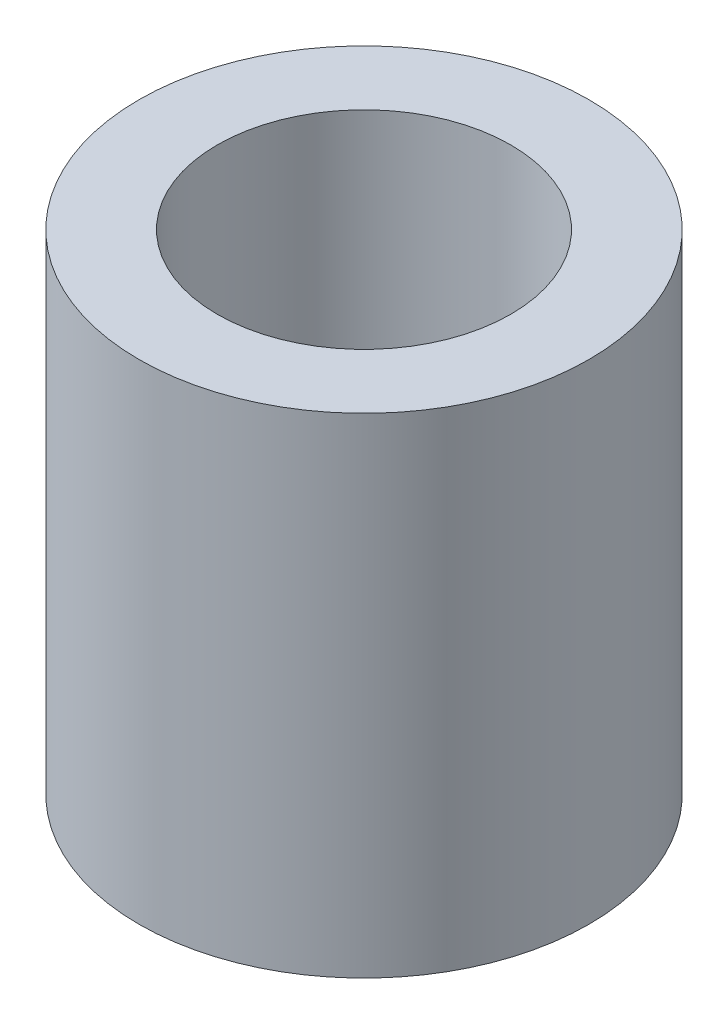
ISO-10303-21;
HEADER;
FILE_DESCRIPTION(('STEP AP214'),'2;1');
FILE_NAME('part.step','',(''),(''),'','','');
FILE_SCHEMA(('AUTOMOTIVE_DESIGN { 1 0 10303 214 1 1 1 1 }'));
ENDSEC;
DATA;
#1=APPLICATION_CONTEXT('core data for automotive mechanical design processes');
#2=APPLICATION_PROTOCOL_DEFINITION('international standard','automotive_design',2000,#1);
#3=PRODUCT_CONTEXT('',#1,'mechanical');
#4=PRODUCT('Part','Part','',(#3));
#5=PRODUCT_RELATED_PRODUCT_CATEGORY('part','',(#4));
#6=PRODUCT_DEFINITION_FORMATION('','',#4);
#7=PRODUCT_DEFINITION_CONTEXT('part definition',#1,'design');
#8=PRODUCT_DEFINITION('design','',#6,#7);
#9=PRODUCT_DEFINITION_SHAPE('','',#8);
#10=(LENGTH_UNIT() NAMED_UNIT(*) SI_UNIT(.MILLI.,.METRE.));
#11=(NAMED_UNIT(*) PLANE_ANGLE_UNIT() SI_UNIT($,.RADIAN.));
#12=(NAMED_UNIT(*) SI_UNIT($,.STERADIAN.) SOLID_ANGLE_UNIT());
#13=UNCERTAINTY_MEASURE_WITH_UNIT(LENGTH_MEASURE(1.E-05),#10,'distance_accuracy_value','');
#14=(GEOMETRIC_REPRESENTATION_CONTEXT(3) GLOBAL_UNCERTAINTY_ASSIGNED_CONTEXT((#13)) GLOBAL_UNIT_ASSIGNED_CONTEXT((#10,
#11,#12)) REPRESENTATION_CONTEXT('',''));
#15=CARTESIAN_POINT('',(0.,0.,0.));
#16=DIRECTION('',(0.,0.,1.));
#17=DIRECTION('',(1.,0.,0.));
#18=AXIS2_PLACEMENT_3D('',#15,#16,#17);
#19=CARTESIAN_POINT('',(0.,0.,0.));
#20=DIRECTION('',(0.,-1.,0.));
#21=DIRECTION('',(0.,0.,-1.));
#22=AXIS2_PLACEMENT_3D('',#19,#20,#21);
#23=CYLINDRICAL_SURFACE('',#22,1.5);
#24=CARTESIAN_POINT('',(0.,5.,0.));
#25=DIRECTION('',(0.,-1.,0.));
#26=DIRECTION('',(0.,0.,-1.));
#27=AXIS2_PLACEMENT_3D('',#24,#25,#26);
#28=CIRCLE('',#27,1.5);
#29=CARTESIAN_POINT('',(0.,5.,-1.5));
#30=VERTEX_POINT('',#29);
#31=EDGE_CURVE('E10',#30,#30,#28,.T.);
#32=ORIENTED_EDGE('',*,*,#31,.F.);
#33=EDGE_LOOP('',(#32));
#34=FACE_BOUND('',#33,.T.);
#35=CARTESIAN_POINT('',(0.,0.,0.));
#36=DIRECTION('',(0.,-1.,0.));
#37=DIRECTION('',(0.,0.,-1.));
#38=AXIS2_PLACEMENT_3D('',#35,#36,#37);
#39=CIRCLE('',#38,1.5);
#40=CARTESIAN_POINT('',(0.,0.,-1.5));
#41=VERTEX_POINT('',#40);
#42=EDGE_CURVE('E44',#41,#41,#39,.T.);
#43=ORIENTED_EDGE('',*,*,#42,.T.);
#44=EDGE_LOOP('',(#43));
#45=FACE_BOUND('',#44,.T.);
#46=ADVANCED_FACE('F30',(#34,#45),#23,.F.);
#47=CARTESIAN_POINT('',(-1.5,5.,0.));
#48=DIRECTION('',(0.,-1.,0.));
#49=DIRECTION('',(0.,0.,-1.));
#50=AXIS2_PLACEMENT_3D('',#47,#48,#49);
#51=PLANE('',#50);
#52=CARTESIAN_POINT('',(0.,5.,0.));
#53=DIRECTION('',(0.,-1.,0.));
#54=DIRECTION('',(0.,0.,-1.));
#55=AXIS2_PLACEMENT_3D('',#52,#53,#54);
#56=CIRCLE('',#55,2.3);
#57=CARTESIAN_POINT('',(0.,5.,-2.3));
#58=VERTEX_POINT('',#57);
#59=EDGE_CURVE('E36',#58,#58,#56,.T.);
#60=ORIENTED_EDGE('',*,*,#59,.F.);
#61=EDGE_LOOP('',(#60));
#62=FACE_BOUND('',#61,.T.);
#63=ORIENTED_EDGE('',*,*,#31,.T.);
#64=EDGE_LOOP('',(#63));
#65=FACE_BOUND('',#64,.T.);
#66=ADVANCED_FACE('F59',(#62,#65),#51,.F.);
#67=CARTESIAN_POINT('',(0.,0.,0.));
#68=DIRECTION('',(0.,-1.,0.));
#69=DIRECTION('',(0.,0.,-1.));
#70=AXIS2_PLACEMENT_3D('',#67,#68,#69);
#71=CYLINDRICAL_SURFACE('',#70,2.3);
#72=CARTESIAN_POINT('',(0.,0.,0.));
#73=DIRECTION('',(0.,-1.,0.));
#74=DIRECTION('',(0.,0.,-1.));
#75=AXIS2_PLACEMENT_3D('',#72,#73,#74);
#76=CIRCLE('',#75,2.3);
#77=CARTESIAN_POINT('',(0.,0.,-2.3));
#78=VERTEX_POINT('',#77);
#79=EDGE_CURVE('E40',#78,#78,#76,.T.);
#80=ORIENTED_EDGE('',*,*,#79,.F.);
#81=EDGE_LOOP('',(#80));
#82=FACE_BOUND('',#81,.T.);
#83=ORIENTED_EDGE('',*,*,#59,.T.);
#84=EDGE_LOOP('',(#83));
#85=FACE_BOUND('',#84,.T.);
#86=ADVANCED_FACE('F54',(#82,#85),#71,.T.);
#87=CARTESIAN_POINT('',(-1.5,0.,0.));
#88=DIRECTION('',(0.,1.,0.));
#89=DIRECTION('',(0.,0.,1.));
#90=AXIS2_PLACEMENT_3D('',#87,#88,#89);
#91=PLANE('',#90);
#92=ORIENTED_EDGE('',*,*,#42,.F.);
#93=EDGE_LOOP('',(#92));
#94=FACE_BOUND('',#93,.T.);
#95=ORIENTED_EDGE('',*,*,#79,.T.);
#96=EDGE_LOOP('',(#95));
#97=FACE_BOUND('',#96,.T.);
#98=ADVANCED_FACE('F51',(#94,#97),#91,.F.);
#99=CLOSED_SHELL('',(#46,#66,#86,#98));
#100=MANIFOLD_SOLID_BREP('B2',#99);
#101=ADVANCED_BREP_SHAPE_REPRESENTATION('',(#18,#100),#14);
#102=SHAPE_DEFINITION_REPRESENTATION(#9,#101);
ENDSEC;
END-ISO-10303-21;
